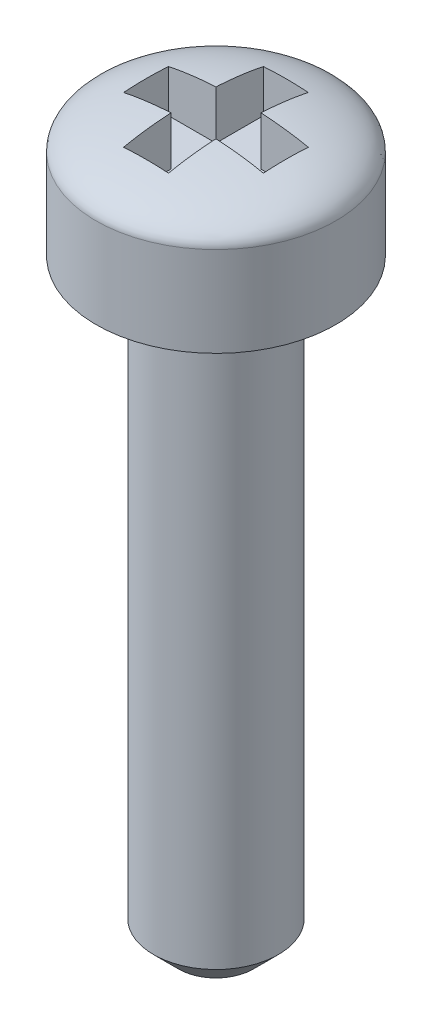
ISO-10303-21;
HEADER;
FILE_DESCRIPTION(('STEP AP214'),'2;1');
FILE_NAME('part.step','',(''),(''),'','','');
FILE_SCHEMA(('AUTOMOTIVE_DESIGN { 1 0 10303 214 1 1 1 1 }'));
ENDSEC;
DATA;
#1=APPLICATION_CONTEXT('core data for automotive mechanical design processes');
#2=APPLICATION_PROTOCOL_DEFINITION('international standard','automotive_design',2000,#1);
#3=PRODUCT_CONTEXT('',#1,'mechanical');
#4=PRODUCT('Part','Part','',(#3));
#5=PRODUCT_RELATED_PRODUCT_CATEGORY('part','',(#4));
#6=PRODUCT_DEFINITION_FORMATION('','',#4);
#7=PRODUCT_DEFINITION_CONTEXT('part definition',#1,'design');
#8=PRODUCT_DEFINITION('design','',#6,#7);
#9=PRODUCT_DEFINITION_SHAPE('','',#8);
#10=(LENGTH_UNIT() NAMED_UNIT(*) SI_UNIT(.MILLI.,.METRE.));
#11=(NAMED_UNIT(*) PLANE_ANGLE_UNIT() SI_UNIT($,.RADIAN.));
#12=(NAMED_UNIT(*) SI_UNIT($,.STERADIAN.) SOLID_ANGLE_UNIT());
#13=UNCERTAINTY_MEASURE_WITH_UNIT(LENGTH_MEASURE(1.E-05),#10,'distance_accuracy_value','');
#14=(GEOMETRIC_REPRESENTATION_CONTEXT(3) GLOBAL_UNCERTAINTY_ASSIGNED_CONTEXT((#13)) GLOBAL_UNIT_ASSIGNED_CONTEXT((#10,
#11,#12)) REPRESENTATION_CONTEXT('',''));
#15=CARTESIAN_POINT('',(0.,0.,0.));
#16=DIRECTION('',(0.,0.,1.));
#17=DIRECTION('',(1.,0.,0.));
#18=AXIS2_PLACEMENT_3D('',#15,#16,#17);
#19=CARTESIAN_POINT('',(0.,-14.5,0.));
#20=DIRECTION('',(0.,-1.,0.));
#21=DIRECTION('',(1.,0.,0.));
#22=AXIS2_PLACEMENT_3D('',#19,#20,#21);
#23=PLANE('',#22);
#24=CARTESIAN_POINT('',(0.,-14.5,0.));
#25=DIRECTION('',(0.,1.,0.));
#26=DIRECTION('',(-1.,0.,0.));
#27=AXIS2_PLACEMENT_3D('',#24,#25,#26);
#28=CIRCLE('',#27,0.750000000000002);
#29=CARTESIAN_POINT('',(-0.750000000000003,-14.5,0.));
#30=VERTEX_POINT('',#29);
#31=EDGE_CURVE('E172',#30,#30,#28,.T.);
#32=ORIENTED_EDGE('',*,*,#31,.F.);
#33=EDGE_LOOP('',(#32));
#34=FACE_BOUND('',#33,.T.);
#35=ADVANCED_FACE('F32',(#34),#23,.T.);
#36=CARTESIAN_POINT('',(0.,-0.7,0.));
#37=DIRECTION('',(0.,0.,1.));
#38=DIRECTION('',(-1.,0.,0.));
#39=AXIS2_PLACEMENT_3D('',#36,#37,#38);
#40=ELLIPSE('',#39,2.4,0.7);
#41=TRIMMED_CURVE('',#40,(PARAMETER_VALUE(4.71238898038469)),
(PARAMETER_VALUE(7.85398163397448)),.T.,.PARAMETER.);
#42=CARTESIAN_POINT('',(0.,0.,0.));
#43=DIRECTION('',(0.,1.,0.));
#44=AXIS1_PLACEMENT('',#42,#43);
#45=SURFACE_OF_REVOLUTION('',#41,#44);
#46=CARTESIAN_POINT('',(-0.45,-0.146793595130272,-1.4));
#47=CARTESIAN_POINT('',(-0.45,-0.135582510868077,-1.3478630783531));
#48=CARTESIAN_POINT('',(-0.45,-0.125272540703667,-1.29553939648451));
#49=CARTESIAN_POINT('',(-0.45,-0.106284613237851,-1.19067152435324));
#50=CARTESIAN_POINT('',(-0.45,-0.0976043872413721,-1.13812774629218));
#51=CARTESIAN_POINT('',(-0.45,-0.0816797603127905,-1.03285537623687));
#52=CARTESIAN_POINT('',(-0.45,-0.0744345609484523,-0.980126903719571));
#53=CARTESIAN_POINT('',(-0.45,-0.061255094243421,-0.874515075797136));
#54=CARTESIAN_POINT('',(-0.45,-0.0553206291320952,-0.821631744979628));
#55=CARTESIAN_POINT('',(-0.45,-0.0446639929310028,-0.715706069557348));
#56=CARTESIAN_POINT('',(-0.45,-0.0399426840621264,-0.662663638814433));
#57=CARTESIAN_POINT('',(-0.45,-0.0316501207388798,-0.556424085564358));
#58=CARTESIAN_POINT('',(-0.45,-0.0280802660002401,-0.503226853511595));
#59=CARTESIAN_POINT('',(-0.45,-0.0250578728513088,-0.449999999999999));
#60=B_SPLINE_CURVE_WITH_KNOTS('',3,(#46,#47,#48,#49,#50,#51,#52,#53,#54,#55,#56,#57,#58,#59),
.UNSPECIFIED.,.F.,.F.,(4,2,2,2,2,2,4),(0.,0.15996808704616,0.319711811185746,0.479366404537297,
0.63899689186355,0.798740520758241,0.958677609631265),.UNSPECIFIED.);
#61=CARTESIAN_POINT('',(-0.45,-0.146793595130272,-1.4));
#62=VERTEX_POINT('',#61);
#63=CARTESIAN_POINT('',(-0.45,-0.0250578728513089,-0.45));
#64=VERTEX_POINT('',#63);
#65=EDGE_CURVE('E11',#62,#64,#60,.T.);
#66=ORIENTED_EDGE('',*,*,#65,.F.);
#67=CARTESIAN_POINT('',(0.45,-0.146793595130272,-1.4));
#68=CARTESIAN_POINT('',(0.400036381373439,-0.143339935814697,-1.4));
#69=CARTESIAN_POINT('',(0.350032330421605,-0.140484168269285,-1.4));
#70=CARTESIAN_POINT('',(0.250023244110168,-0.135939007443069,-1.4));
#71=CARTESIAN_POINT('',(0.200018263881785,-0.134248403967048,-1.4));
#72=CARTESIAN_POINT('',(0.100008847147215,-0.131997688845388,-1.4));
#73=CARTESIAN_POINT('',(0.0500044235736076,-0.131436996552805,-1.4));
#74=CARTESIAN_POINT('',(-0.0500044235736076,-0.131436996552805,-1.4));
#75=CARTESIAN_POINT('',(-0.100008847147215,-0.131997688845388,-1.4));
#76=CARTESIAN_POINT('',(-0.200018263881785,-0.134248403967048,-1.4));
#77=CARTESIAN_POINT('',(-0.250023244110168,-0.135939007443069,-1.4));
#78=CARTESIAN_POINT('',(-0.350032330421605,-0.140484168269285,-1.4));
#79=CARTESIAN_POINT('',(-0.400036381373439,-0.143339935814697,-1.4));
#80=CARTESIAN_POINT('',(-0.45,-0.146793595130272,-1.4));
#81=B_SPLINE_CURVE_WITH_KNOTS('',3,(#67,#68,#69,#70,#71,#72,#73,#74,#75,#76,#77,#78,#79,#80),
.UNSPECIFIED.,.F.,.F.,(4,2,2,2,2,2,4),(0.,0.150243606811157,0.300330927284267,0.450341100109752,
0.600351272935238,0.750438593408348,0.900682200219505),.UNSPECIFIED.);
#82=CARTESIAN_POINT('',(0.45,-0.146793595130272,-1.4));
#83=VERTEX_POINT('',#82);
#84=EDGE_CURVE('E43',#83,#62,#81,.T.);
#85=ORIENTED_EDGE('',*,*,#84,.F.);
#86=CARTESIAN_POINT('',(0.45,-0.0250578728513089,-0.45));
#87=CARTESIAN_POINT('',(0.45,-0.0280802660002401,-0.503226853511596));
#88=CARTESIAN_POINT('',(0.45,-0.0316501207388798,-0.556424085564358));
#89=CARTESIAN_POINT('',(0.45,-0.0399426840621265,-0.662663638814433));
#90=CARTESIAN_POINT('',(0.45,-0.0446639929310029,-0.715706069557348));
#91=CARTESIAN_POINT('',(0.45,-0.0553206291320953,-0.821631744979629));
#92=CARTESIAN_POINT('',(0.45,-0.061255094243421,-0.874515075797136));
#93=CARTESIAN_POINT('',(0.45,-0.0744345609484524,-0.980126903719572));
#94=CARTESIAN_POINT('',(0.45,-0.0816797603127905,-1.03285537623687));
#95=CARTESIAN_POINT('',(0.45,-0.0976043872413722,-1.13812774629218));
#96=CARTESIAN_POINT('',(0.45,-0.106284613237851,-1.19067152435324));
#97=CARTESIAN_POINT('',(0.45,-0.125272540703667,-1.29553939648451));
#98=CARTESIAN_POINT('',(0.45,-0.135582510868077,-1.3478630783531));
#99=CARTESIAN_POINT('',(0.449999999999999,-0.146793595130273,-1.4));
#100=B_SPLINE_CURVE_WITH_KNOTS('',3,(#86,#87,#88,#89,#90,#91,#92,#93,#94,#95,#96,#97,#98,#99),
.UNSPECIFIED.,.F.,.F.,(4,2,2,2,2,2,4),(0.,0.159937088873024,0.319680717767715,0.479311205093968,
0.638965798445519,0.798709522585105,0.958677609631265),.UNSPECIFIED.);
#101=CARTESIAN_POINT('',(0.45,-0.0250578728513089,-0.45));
#102=VERTEX_POINT('',#101);
#103=EDGE_CURVE('E277',#102,#83,#100,.T.);
#104=ORIENTED_EDGE('',*,*,#103,.F.);
#105=CARTESIAN_POINT('',(1.4,-0.146793595130273,-0.45));
#106=CARTESIAN_POINT('',(1.3478630783531,-0.135582510868078,-0.45));
#107=CARTESIAN_POINT('',(1.29553939648451,-0.125272540703667,-0.45));
#108=CARTESIAN_POINT('',(1.19067152435324,-0.106284613237851,-0.45));
#109=CARTESIAN_POINT('',(1.13812774629218,-0.0976043872413722,-0.45));
#110=CARTESIAN_POINT('',(1.03285537623687,-0.0816797603127905,-0.45));
#111=CARTESIAN_POINT('',(0.980126903719572,-0.0744345609484524,-0.45));
#112=CARTESIAN_POINT('',(0.874515075797136,-0.061255094243421,-0.45));
#113=CARTESIAN_POINT('',(0.821631744979628,-0.0553206291320953,-0.45));
#114=CARTESIAN_POINT('',(0.715706069557348,-0.0446639929310028,-0.45));
#115=CARTESIAN_POINT('',(0.662663638814433,-0.0399426840621265,-0.45));
#116=CARTESIAN_POINT('',(0.556424085564358,-0.0316501207388798,-0.45));
#117=CARTESIAN_POINT('',(0.503226853511596,-0.0280802660002401,-0.45));
#118=CARTESIAN_POINT('',(0.449999999999999,-0.0250578728513089,-0.45));
#119=B_SPLINE_CURVE_WITH_KNOTS('',3,(#105,#106,#107,#108,#109,#110,#111,#112,#113,#114,#115,
#116,#117,#118),.UNSPECIFIED.,.F.,.F.,(4,2,2,2,2,2,4),(0.,0.15996808704616,0.319711811185746,
0.479366404537297,0.63899689186355,0.798740520758241,0.958677609631265),.UNSPECIFIED.);
#120=CARTESIAN_POINT('',(1.4,-0.146793595130273,-0.45));
#121=VERTEX_POINT('',#120);
#122=EDGE_CURVE('E271',#121,#102,#119,.T.);
#123=ORIENTED_EDGE('',*,*,#122,.F.);
#124=CARTESIAN_POINT('',(1.4,-0.146793595130273,0.45));
#125=CARTESIAN_POINT('',(1.4,-0.143339935814697,0.400036381373439));
#126=CARTESIAN_POINT('',(1.4,-0.140484168269285,0.350032330421605));
#127=CARTESIAN_POINT('',(1.4,-0.135939007443069,0.250023244110168));
#128=CARTESIAN_POINT('',(1.4,-0.134248403967048,0.200018263881785));
#129=CARTESIAN_POINT('',(1.4,-0.131997688845388,0.100008847147215));
#130=CARTESIAN_POINT('',(1.4,-0.131436996552805,0.0500044235736077));
#131=CARTESIAN_POINT('',(1.4,-0.131436996552805,-0.0500044235736073));
#132=CARTESIAN_POINT('',(1.4,-0.131997688845388,-0.100008847147215));
#133=CARTESIAN_POINT('',(1.4,-0.134248403967048,-0.200018263881785));
#134=CARTESIAN_POINT('',(1.4,-0.135939007443069,-0.250023244110168));
#135=CARTESIAN_POINT('',(1.4,-0.140484168269285,-0.350032330421605));
#136=CARTESIAN_POINT('',(1.4,-0.143339935814697,-0.400036381373439));
#137=CARTESIAN_POINT('',(1.4,-0.146793595130273,-0.449999999999999));
#138=B_SPLINE_CURVE_WITH_KNOTS('',3,(#124,#125,#126,#127,#128,#129,#130,#131,#132,#133,#134,
#135,#136,#137),.UNSPECIFIED.,.F.,.F.,(4,2,2,2,2,2,4),(0.,0.150243606811157,0.300330927284267,
0.450341100109752,0.600351272935237,0.750438593408347,0.900682200219504),.UNSPECIFIED.);
#139=CARTESIAN_POINT('',(1.4,-0.146793595130273,0.45));
#140=VERTEX_POINT('',#139);
#141=EDGE_CURVE('E264',#140,#121,#138,.T.);
#142=ORIENTED_EDGE('',*,*,#141,.F.);
#143=CARTESIAN_POINT('',(0.45,-0.0250578728513089,0.45));
#144=CARTESIAN_POINT('',(0.503226853511596,-0.0280802660002401,0.45));
#145=CARTESIAN_POINT('',(0.556424085564358,-0.0316501207388799,0.45));
#146=CARTESIAN_POINT('',(0.662663638814433,-0.0399426840621265,0.45));
#147=CARTESIAN_POINT('',(0.715706069557348,-0.0446639929310029,0.45));
#148=CARTESIAN_POINT('',(0.821631744979629,-0.0553206291320953,0.45));
#149=CARTESIAN_POINT('',(0.874515075797136,-0.0612550942434211,0.45));
#150=CARTESIAN_POINT('',(0.980126903719572,-0.0744345609484524,0.45));
#151=CARTESIAN_POINT('',(1.03285537623687,-0.0816797603127906,0.45));
#152=CARTESIAN_POINT('',(1.13812774629218,-0.0976043872413723,0.45));
#153=CARTESIAN_POINT('',(1.19067152435324,-0.106284613237851,0.45));
#154=CARTESIAN_POINT('',(1.29553939648451,-0.125272540703667,0.45));
#155=CARTESIAN_POINT('',(1.3478630783531,-0.135582510868078,0.45));
#156=CARTESIAN_POINT('',(1.4,-0.146793595130273,0.45));
#157=B_SPLINE_CURVE_WITH_KNOTS('',3,(#143,#144,#145,#146,#147,#148,#149,#150,#151,#152,#153,
#154,#155,#156),.UNSPECIFIED.,.F.,.F.,(4,2,2,2,2,2,4),(0.,0.159937088873024,0.319680717767716,
0.479311205093968,0.638965798445519,0.798709522585105,0.958677609631265),.UNSPECIFIED.);
#158=CARTESIAN_POINT('',(0.45,-0.0250578728513089,0.45));
#159=VERTEX_POINT('',#158);
#160=EDGE_CURVE('E257',#159,#140,#157,.T.);
#161=ORIENTED_EDGE('',*,*,#160,.F.);
#162=CARTESIAN_POINT('',(0.45,-0.146793595130272,1.4));
#163=CARTESIAN_POINT('',(0.45,-0.135582510868077,1.3478630783531));
#164=CARTESIAN_POINT('',(0.45,-0.125272540703667,1.29553939648451));
#165=CARTESIAN_POINT('',(0.45,-0.106284613237851,1.19067152435324));
#166=CARTESIAN_POINT('',(0.45,-0.0976043872413722,1.13812774629218));
#167=CARTESIAN_POINT('',(0.45,-0.0816797603127905,1.03285537623687));
#168=CARTESIAN_POINT('',(0.45,-0.0744345609484524,0.980126903719571));
#169=CARTESIAN_POINT('',(0.45,-0.061255094243421,0.874515075797136));
#170=CARTESIAN_POINT('',(0.45,-0.0553206291320953,0.821631744979628));
#171=CARTESIAN_POINT('',(0.45,-0.0446639929310028,0.715706069557348));
#172=CARTESIAN_POINT('',(0.45,-0.0399426840621265,0.662663638814433));
#173=CARTESIAN_POINT('',(0.45,-0.0316501207388798,0.556424085564358));
#174=CARTESIAN_POINT('',(0.45,-0.0280802660002401,0.503226853511595));
#175=CARTESIAN_POINT('',(0.45,-0.0250578728513089,0.449999999999999));
#176=B_SPLINE_CURVE_WITH_KNOTS('',3,(#162,#163,#164,#165,#166,#167,#168,#169,#170,#171,#172,
#173,#174,#175),.UNSPECIFIED.,.F.,.F.,(4,2,2,2,2,2,4),(0.,0.15996808704616,0.319711811185746,
0.479366404537297,0.63899689186355,0.798740520758241,0.958677609631265),.UNSPECIFIED.);
#177=CARTESIAN_POINT('',(0.45,-0.146793595130272,1.4));
#178=VERTEX_POINT('',#177);
#179=EDGE_CURVE('E250',#178,#159,#176,.T.);
#180=ORIENTED_EDGE('',*,*,#179,.F.);
#181=CARTESIAN_POINT('',(-0.45,-0.146793595130272,1.4));
#182=CARTESIAN_POINT('',(-0.400036381373439,-0.143339935814697,1.4));
#183=CARTESIAN_POINT('',(-0.350032330421605,-0.140484168269285,1.4));
#184=CARTESIAN_POINT('',(-0.250023244110168,-0.135939007443069,1.4));
#185=CARTESIAN_POINT('',(-0.200018263881785,-0.134248403967048,1.4));
#186=CARTESIAN_POINT('',(-0.100008847147215,-0.131997688845388,1.4));
#187=CARTESIAN_POINT('',(-0.0500044235736078,-0.131436996552805,1.4));
#188=CARTESIAN_POINT('',(0.0500044235736073,-0.131436996552805,1.4));
#189=CARTESIAN_POINT('',(0.100008847147215,-0.131997688845388,1.4));
#190=CARTESIAN_POINT('',(0.200018263881785,-0.134248403967048,1.4));
#191=CARTESIAN_POINT('',(0.250023244110168,-0.135939007443069,1.4));
#192=CARTESIAN_POINT('',(0.350032330421605,-0.140484168269285,1.4));
#193=CARTESIAN_POINT('',(0.400036381373439,-0.143339935814697,1.4));
#194=CARTESIAN_POINT('',(0.449999999999999,-0.146793595130273,1.4));
#195=B_SPLINE_CURVE_WITH_KNOTS('',3,(#181,#182,#183,#184,#185,#186,#187,#188,#189,#190,#191,
#192,#193,#194),.UNSPECIFIED.,.F.,.F.,(4,2,2,2,2,2,4),(0.,0.150243606811157,0.300330927284267,
0.450341100109752,0.600351272935237,0.750438593408347,0.900682200219504),.UNSPECIFIED.);
#196=CARTESIAN_POINT('',(-0.45,-0.146793595130273,1.4));
#197=VERTEX_POINT('',#196);
#198=EDGE_CURVE('E243',#197,#178,#195,.T.);
#199=ORIENTED_EDGE('',*,*,#198,.F.);
#200=CARTESIAN_POINT('',(-0.45,-0.0250578728513089,0.45));
#201=CARTESIAN_POINT('',(-0.45,-0.0280802660002401,0.503226853511596));
#202=CARTESIAN_POINT('',(-0.45,-0.0316501207388798,0.556424085564358));
#203=CARTESIAN_POINT('',(-0.45,-0.0399426840621264,0.662663638814433));
#204=CARTESIAN_POINT('',(-0.45,-0.0446639929310028,0.715706069557348));
#205=CARTESIAN_POINT('',(-0.45,-0.0553206291320952,0.821631744979628));
#206=CARTESIAN_POINT('',(-0.45,-0.061255094243421,0.874515075797136));
#207=CARTESIAN_POINT('',(-0.45,-0.0744345609484523,0.980126903719571));
#208=CARTESIAN_POINT('',(-0.45,-0.0816797603127905,1.03285537623687));
#209=CARTESIAN_POINT('',(-0.45,-0.0976043872413721,1.13812774629218));
#210=CARTESIAN_POINT('',(-0.45,-0.10628461323785,1.19067152435324));
#211=CARTESIAN_POINT('',(-0.45,-0.125272540703667,1.29553939648451));
#212=CARTESIAN_POINT('',(-0.45,-0.135582510868077,1.3478630783531));
#213=CARTESIAN_POINT('',(-0.45,-0.146793595130272,1.4));
#214=B_SPLINE_CURVE_WITH_KNOTS('',3,(#200,#201,#202,#203,#204,#205,#206,#207,#208,#209,#210,
#211,#212,#213),.UNSPECIFIED.,.F.,.F.,(4,2,2,2,2,2,4),(0.,0.159937088873024,0.319680717767715,
0.479311205093968,0.638965798445519,0.798709522585104,0.958677609631264),.UNSPECIFIED.);
#215=CARTESIAN_POINT('',(-0.45,-0.0250578728513089,0.45));
#216=VERTEX_POINT('',#215);
#217=EDGE_CURVE('E236',#216,#197,#214,.T.);
#218=ORIENTED_EDGE('',*,*,#217,.F.);
#219=CARTESIAN_POINT('',(-1.4,-0.146793595130272,0.45));
#220=CARTESIAN_POINT('',(-1.3478630783531,-0.135582510868077,0.45));
#221=CARTESIAN_POINT('',(-1.29553939648451,-0.125272540703667,0.45));
#222=CARTESIAN_POINT('',(-1.19067152435324,-0.10628461323785,0.45));
#223=CARTESIAN_POINT('',(-1.13812774629218,-0.0976043872413721,0.45));
#224=CARTESIAN_POINT('',(-1.03285537623687,-0.0816797603127904,0.45));
#225=CARTESIAN_POINT('',(-0.980126903719571,-0.0744345609484523,0.45));
#226=CARTESIAN_POINT('',(-0.874515075797136,-0.0612550942434209,0.45));
#227=CARTESIAN_POINT('',(-0.821631744979628,-0.0553206291320952,0.45));
#228=CARTESIAN_POINT('',(-0.715706069557348,-0.0446639929310027,0.45));
#229=CARTESIAN_POINT('',(-0.662663638814433,-0.0399426840621264,0.45));
#230=CARTESIAN_POINT('',(-0.556424085564358,-0.0316501207388797,0.45));
#231=CARTESIAN_POINT('',(-0.503226853511595,-0.02808026600024,0.45));
#232=CARTESIAN_POINT('',(-0.45,-0.0250578728513088,0.45));
#233=B_SPLINE_CURVE_WITH_KNOTS('',3,(#219,#220,#221,#222,#223,#224,#225,#226,#227,#228,#229,
#230,#231,#232),.UNSPECIFIED.,.F.,.F.,(4,2,2,2,2,2,4),(0.,0.15996808704616,0.319711811185746,
0.479366404537297,0.63899689186355,0.798740520758241,0.958677609631265),.UNSPECIFIED.);
#234=CARTESIAN_POINT('',(-1.4,-0.146793595130272,0.45));
#235=VERTEX_POINT('',#234);
#236=EDGE_CURVE('E229',#235,#216,#233,.T.);
#237=ORIENTED_EDGE('',*,*,#236,.F.);
#238=CARTESIAN_POINT('',(-1.4,-0.146793595130272,-0.45));
#239=CARTESIAN_POINT('',(-1.4,-0.143339935814697,-0.400036381373439));
#240=CARTESIAN_POINT('',(-1.4,-0.140484168269285,-0.350032330421606));
#241=CARTESIAN_POINT('',(-1.4,-0.135939007443069,-0.250023244110169));
#242=CARTESIAN_POINT('',(-1.4,-0.134248403967048,-0.200018263881786));
#243=CARTESIAN_POINT('',(-1.4,-0.131997688845388,-0.100008847147215));
#244=CARTESIAN_POINT('',(-1.4,-0.131436996552805,-0.0500044235736077));
#245=CARTESIAN_POINT('',(-1.4,-0.131436996552805,0.0500044235736075));
#246=CARTESIAN_POINT('',(-1.4,-0.131997688845388,0.100008847147215));
#247=CARTESIAN_POINT('',(-1.4,-0.134248403967048,0.200018263881785));
#248=CARTESIAN_POINT('',(-1.4,-0.135939007443069,0.250023244110168));
#249=CARTESIAN_POINT('',(-1.4,-0.140484168269285,0.350032330421605));
#250=CARTESIAN_POINT('',(-1.4,-0.143339935814697,0.400036381373439));
#251=CARTESIAN_POINT('',(-1.4,-0.146793595130272,0.45));
#252=B_SPLINE_CURVE_WITH_KNOTS('',3,(#238,#239,#240,#241,#242,#243,#244,#245,#246,#247,#248,
#249,#250,#251),.UNSPECIFIED.,.F.,.F.,(4,2,2,2,2,2,4),(0.,0.150243606811157,0.300330927284267,
0.450341100109753,0.600351272935238,0.750438593408348,0.900682200219506),.UNSPECIFIED.);
#253=CARTESIAN_POINT('',(-1.4,-0.146793595130272,-0.45));
#254=VERTEX_POINT('',#253);
#255=EDGE_CURVE('E222',#254,#235,#252,.T.);
#256=ORIENTED_EDGE('',*,*,#255,.F.);
#257=CARTESIAN_POINT('',(-0.45,-0.0250578728513089,-0.45));
#258=CARTESIAN_POINT('',(-0.503226853511596,-0.0280802660002401,-0.45));
#259=CARTESIAN_POINT('',(-0.556424085564358,-0.0316501207388798,-0.45));
#260=CARTESIAN_POINT('',(-0.662663638814433,-0.0399426840621264,-0.45));
#261=CARTESIAN_POINT('',(-0.715706069557348,-0.0446639929310028,-0.45));
#262=CARTESIAN_POINT('',(-0.821631744979628,-0.0553206291320952,-0.45));
#263=CARTESIAN_POINT('',(-0.874515075797136,-0.0612550942434209,-0.45));
#264=CARTESIAN_POINT('',(-0.980126903719571,-0.0744345609484523,-0.45));
#265=CARTESIAN_POINT('',(-1.03285537623687,-0.0816797603127905,-0.45));
#266=CARTESIAN_POINT('',(-1.13812774629218,-0.0976043872413721,-0.45));
#267=CARTESIAN_POINT('',(-1.19067152435324,-0.10628461323785,-0.45));
#268=CARTESIAN_POINT('',(-1.29553939648451,-0.125272540703667,-0.45));
#269=CARTESIAN_POINT('',(-1.3478630783531,-0.135582510868077,-0.45));
#270=CARTESIAN_POINT('',(-1.4,-0.146793595130272,-0.45));
#271=B_SPLINE_CURVE_WITH_KNOTS('',3,(#257,#258,#259,#260,#261,#262,#263,#264,#265,#266,#267,
#268,#269,#270),.UNSPECIFIED.,.F.,.F.,(4,2,2,2,2,2,4),(0.,0.159937088873024,0.319680717767715,
0.479311205093968,0.638965798445519,0.798709522585104,0.958677609631264),.UNSPECIFIED.);
#272=EDGE_CURVE('E213',#64,#254,#271,.T.);
#273=ORIENTED_EDGE('',*,*,#272,.F.);
#274=EDGE_LOOP('',(#66,#85,#104,#123,#142,#161,#180,#199,#218,#237,#256,#273));
#275=FACE_BOUND('',#274,.T.);
#276=CARTESIAN_POINT('',(0.,-0.7,0.));
#277=DIRECTION('',(0.,1.,0.));
#278=DIRECTION('',(-1.,0.,0.));
#279=AXIS2_PLACEMENT_3D('',#276,#277,#278);
#280=CIRCLE('',#279,2.4);
#281=CARTESIAN_POINT('',(-2.4,-0.7,0.));
#282=VERTEX_POINT('',#281);
#283=EDGE_CURVE('E361',#282,#282,#280,.T.);
#284=ORIENTED_EDGE('',*,*,#283,.T.);
#285=EDGE_LOOP('',(#284));
#286=FACE_BOUND('',#285,.T.);
#287=ADVANCED_FACE('F203',(#275,#286),#45,.F.);
#288=CARTESIAN_POINT('',(0.,0.,0.));
#289=DIRECTION('',(0.,1.,0.));
#290=DIRECTION('',(-1.,0.,0.));
#291=AXIS2_PLACEMENT_3D('',#288,#289,#290);
#292=CYLINDRICAL_SURFACE('',#291,2.4);
#293=CARTESIAN_POINT('',(0.,-2.5,0.));
#294=DIRECTION('',(0.,1.,0.));
#295=DIRECTION('',(-1.,0.,0.));
#296=AXIS2_PLACEMENT_3D('',#293,#294,#295);
#297=CIRCLE('',#296,2.4);
#298=CARTESIAN_POINT('',(-2.4,-2.5,0.));
#299=VERTEX_POINT('',#298);
#300=EDGE_CURVE('E357',#299,#299,#297,.T.);
#301=ORIENTED_EDGE('',*,*,#300,.T.);
#302=EDGE_LOOP('',(#301));
#303=FACE_BOUND('',#302,.T.);
#304=ORIENTED_EDGE('',*,*,#283,.F.);
#305=EDGE_LOOP('',(#304));
#306=FACE_BOUND('',#305,.T.);
#307=ADVANCED_FACE('F207',(#303,#306),#292,.T.);
#308=CARTESIAN_POINT('',(-1.25,-2.5,0.));
#309=DIRECTION('',(0.,-1.,0.));
#310=DIRECTION('',(1.,0.,0.));
#311=AXIS2_PLACEMENT_3D('',#308,#309,#310);
#312=PLANE('',#311);
#313=CARTESIAN_POINT('',(0.,-2.5,0.));
#314=DIRECTION('',(0.,1.,0.));
#315=DIRECTION('',(-1.,0.,0.));
#316=AXIS2_PLACEMENT_3D('',#313,#314,#315);
#317=CIRCLE('',#316,1.25);
#318=CARTESIAN_POINT('',(-1.25,-2.5,0.));
#319=VERTEX_POINT('',#318);
#320=EDGE_CURVE('E355',#319,#319,#317,.T.);
#321=ORIENTED_EDGE('',*,*,#320,.T.);
#322=EDGE_LOOP('',(#321));
#323=FACE_BOUND('',#322,.T.);
#324=ORIENTED_EDGE('',*,*,#300,.F.);
#325=EDGE_LOOP('',(#324));
#326=FACE_BOUND('',#325,.T.);
#327=ADVANCED_FACE('F337',(#323,#326),#312,.T.);
#328=CARTESIAN_POINT('',(0.,0.,0.));
#329=DIRECTION('',(0.,1.,0.));
#330=DIRECTION('',(-1.,0.,0.));
#331=AXIS2_PLACEMENT_3D('',#328,#329,#330);
#332=CYLINDRICAL_SURFACE('',#331,1.25);
#333=CARTESIAN_POINT('',(0.,-14.,0.));
#334=DIRECTION('',(0.,1.,0.));
#335=DIRECTION('',(-1.,0.,0.));
#336=AXIS2_PLACEMENT_3D('',#333,#334,#335);
#337=CIRCLE('',#336,1.25);
#338=CARTESIAN_POINT('',(-1.25,-14.,0.));
#339=VERTEX_POINT('',#338);
#340=EDGE_CURVE('E353',#339,#339,#337,.T.);
#341=ORIENTED_EDGE('',*,*,#340,.T.);
#342=EDGE_LOOP('',(#341));
#343=FACE_BOUND('',#342,.T.);
#344=ORIENTED_EDGE('',*,*,#320,.F.);
#345=EDGE_LOOP('',(#344));
#346=FACE_BOUND('',#345,.T.);
#347=ADVANCED_FACE('F334',(#343,#346),#332,.T.);
#348=CARTESIAN_POINT('',(0.,-14.,0.));
#349=DIRECTION('',(0.,1.,0.));
#350=DIRECTION('',(-1.,0.,0.));
#351=AXIS2_PLACEMENT_3D('',#348,#349,#350);
#352=CONICAL_SURFACE('',#351,1.25,0.785398163397447);
#353=ORIENTED_EDGE('',*,*,#31,.T.);
#354=EDGE_LOOP('',(#353));
#355=FACE_BOUND('',#354,.T.);
#356=ORIENTED_EDGE('',*,*,#340,.F.);
#357=EDGE_LOOP('',(#356));
#358=FACE_BOUND('',#357,.T.);
#359=ADVANCED_FACE('F331',(#355,#358),#352,.T.);
#360=CARTESIAN_POINT('',(-0.45,-1.,-1.4));
#361=DIRECTION('',(-1.,0.,0.));
#362=DIRECTION('',(0.,0.,1.));
#363=AXIS2_PLACEMENT_3D('',#360,#361,#362);
#364=PLANE('',#363);
#365=ORIENTED_EDGE('',*,*,#65,.T.);
#366=DIRECTION('',(0.,1.,0.));
#367=VECTOR('',#366,1.);
#368=CARTESIAN_POINT('',(-0.45,-1.,-0.45));
#369=LINE('',#368,#367);
#370=CARTESIAN_POINT('',(-0.45,-1.,-0.45));
#371=VERTEX_POINT('',#370);
#372=EDGE_CURVE('E50',#371,#64,#369,.T.);
#373=ORIENTED_EDGE('',*,*,#372,.F.);
#374=DIRECTION('',(0.,0.,1.));
#375=VECTOR('',#374,1.);
#376=CARTESIAN_POINT('',(-0.45,-1.,-1.4));
#377=LINE('',#376,#375);
#378=CARTESIAN_POINT('',(-0.45,-1.,-1.4));
#379=VERTEX_POINT('',#378);
#380=EDGE_CURVE('E124',#379,#371,#377,.T.);
#381=ORIENTED_EDGE('',*,*,#380,.F.);
#382=DIRECTION('',(0.,1.,0.));
#383=VECTOR('',#382,1.);
#384=CARTESIAN_POINT('',(-0.45,-1.,-1.4));
#385=LINE('',#384,#383);
#386=EDGE_CURVE('E170',#379,#62,#385,.T.);
#387=ORIENTED_EDGE('',*,*,#386,.T.);
#388=EDGE_LOOP('',(#365,#373,#381,#387));
#389=FACE_BOUND('',#388,.T.);
#390=ADVANCED_FACE('F122',(#389),#364,.F.);
#391=CARTESIAN_POINT('',(-0.45,-1.,-1.4));
#392=DIRECTION('',(0.,0.,-1.));
#393=DIRECTION('',(-1.,0.,0.));
#394=AXIS2_PLACEMENT_3D('',#391,#392,#393);
#395=PLANE('',#394);
#396=ORIENTED_EDGE('',*,*,#84,.T.);
#397=ORIENTED_EDGE('',*,*,#386,.F.);
#398=DIRECTION('',(-1.,0.,0.));
#399=VECTOR('',#398,1.);
#400=CARTESIAN_POINT('',(-0.45,-1.,-1.4));
#401=LINE('',#400,#399);
#402=CARTESIAN_POINT('',(0.45,-1.,-1.4));
#403=VERTEX_POINT('',#402);
#404=EDGE_CURVE('E129',#403,#379,#401,.T.);
#405=ORIENTED_EDGE('',*,*,#404,.F.);
#406=DIRECTION('',(0.,1.,0.));
#407=VECTOR('',#406,1.);
#408=CARTESIAN_POINT('',(0.45,-1.,-1.4));
#409=LINE('',#408,#407);
#410=EDGE_CURVE('E173',#403,#83,#409,.T.);
#411=ORIENTED_EDGE('',*,*,#410,.T.);
#412=EDGE_LOOP('',(#396,#397,#405,#411));
#413=FACE_BOUND('',#412,.T.);
#414=ADVANCED_FACE('F286',(#413),#395,.F.);
#415=CARTESIAN_POINT('',(0.45,-1.,-1.4));
#416=DIRECTION('',(1.,0.,0.));
#417=DIRECTION('',(0.,0.,-1.));
#418=AXIS2_PLACEMENT_3D('',#415,#416,#417);
#419=PLANE('',#418);
#420=ORIENTED_EDGE('',*,*,#103,.T.);
#421=ORIENTED_EDGE('',*,*,#410,.F.);
#422=DIRECTION('',(0.,0.,-1.));
#423=VECTOR('',#422,1.);
#424=CARTESIAN_POINT('',(0.45,-1.,-1.4));
#425=LINE('',#424,#423);
#426=CARTESIAN_POINT('',(0.45,-1.,-0.45));
#427=VERTEX_POINT('',#426);
#428=EDGE_CURVE('E167',#427,#403,#425,.T.);
#429=ORIENTED_EDGE('',*,*,#428,.F.);
#430=DIRECTION('',(0.,1.,0.));
#431=VECTOR('',#430,1.);
#432=CARTESIAN_POINT('',(0.45,-1.,-0.45));
#433=LINE('',#432,#431);
#434=EDGE_CURVE('E175',#427,#102,#433,.T.);
#435=ORIENTED_EDGE('',*,*,#434,.T.);
#436=EDGE_LOOP('',(#420,#421,#429,#435));
#437=FACE_BOUND('',#436,.T.);
#438=ADVANCED_FACE('F290',(#437),#419,.F.);
#439=CARTESIAN_POINT('',(0.45,-1.,-0.45));
#440=DIRECTION('',(0.,0.,-1.));
#441=DIRECTION('',(-1.,0.,0.));
#442=AXIS2_PLACEMENT_3D('',#439,#440,#441);
#443=PLANE('',#442);
#444=ORIENTED_EDGE('',*,*,#122,.T.);
#445=ORIENTED_EDGE('',*,*,#434,.F.);
#446=DIRECTION('',(-1.,0.,0.));
#447=VECTOR('',#446,1.);
#448=CARTESIAN_POINT('',(0.45,-1.,-0.45));
#449=LINE('',#448,#447);
#450=CARTESIAN_POINT('',(1.4,-1.,-0.45));
#451=VERTEX_POINT('',#450);
#452=EDGE_CURVE('E164',#451,#427,#449,.T.);
#453=ORIENTED_EDGE('',*,*,#452,.F.);
#454=DIRECTION('',(0.,1.,0.));
#455=VECTOR('',#454,1.);
#456=CARTESIAN_POINT('',(1.4,-1.,-0.45));
#457=LINE('',#456,#455);
#458=EDGE_CURVE('E178',#451,#121,#457,.T.);
#459=ORIENTED_EDGE('',*,*,#458,.T.);
#460=EDGE_LOOP('',(#444,#445,#453,#459));
#461=FACE_BOUND('',#460,.T.);
#462=ADVANCED_FACE('F293',(#461),#443,.F.);
#463=CARTESIAN_POINT('',(1.4,-1.,0.45));
#464=DIRECTION('',(1.,0.,0.));
#465=DIRECTION('',(0.,0.,-1.));
#466=AXIS2_PLACEMENT_3D('',#463,#464,#465);
#467=PLANE('',#466);
#468=ORIENTED_EDGE('',*,*,#141,.T.);
#469=ORIENTED_EDGE('',*,*,#458,.F.);
#470=DIRECTION('',(0.,0.,-1.));
#471=VECTOR('',#470,1.);
#472=CARTESIAN_POINT('',(1.4,-1.,0.45));
#473=LINE('',#472,#471);
#474=CARTESIAN_POINT('',(1.4,-1.,0.45));
#475=VERTEX_POINT('',#474);
#476=EDGE_CURVE('E161',#475,#451,#473,.T.);
#477=ORIENTED_EDGE('',*,*,#476,.F.);
#478=DIRECTION('',(0.,1.,0.));
#479=VECTOR('',#478,1.);
#480=CARTESIAN_POINT('',(1.4,-1.,0.45));
#481=LINE('',#480,#479);
#482=EDGE_CURVE('E181',#475,#140,#481,.T.);
#483=ORIENTED_EDGE('',*,*,#482,.T.);
#484=EDGE_LOOP('',(#468,#469,#477,#483));
#485=FACE_BOUND('',#484,.T.);
#486=ADVANCED_FACE('F297',(#485),#467,.F.);
#487=CARTESIAN_POINT('',(0.45,-1.,0.45));
#488=DIRECTION('',(0.,0.,1.));
#489=DIRECTION('',(1.,0.,0.));
#490=AXIS2_PLACEMENT_3D('',#487,#488,#489);
#491=PLANE('',#490);
#492=ORIENTED_EDGE('',*,*,#160,.T.);
#493=ORIENTED_EDGE('',*,*,#482,.F.);
#494=DIRECTION('',(1.,0.,0.));
#495=VECTOR('',#494,1.);
#496=CARTESIAN_POINT('',(0.45,-1.,0.45));
#497=LINE('',#496,#495);
#498=CARTESIAN_POINT('',(0.45,-1.,0.45));
#499=VERTEX_POINT('',#498);
#500=EDGE_CURVE('E158',#499,#475,#497,.T.);
#501=ORIENTED_EDGE('',*,*,#500,.F.);
#502=DIRECTION('',(0.,1.,0.));
#503=VECTOR('',#502,1.);
#504=CARTESIAN_POINT('',(0.45,-1.,0.45));
#505=LINE('',#504,#503);
#506=EDGE_CURVE('E184',#499,#159,#505,.T.);
#507=ORIENTED_EDGE('',*,*,#506,.T.);
#508=EDGE_LOOP('',(#492,#493,#501,#507));
#509=FACE_BOUND('',#508,.T.);
#510=ADVANCED_FACE('F301',(#509),#491,.F.);
#511=CARTESIAN_POINT('',(0.45,-1.,0.45));
#512=DIRECTION('',(1.,0.,0.));
#513=DIRECTION('',(0.,0.,-1.));
#514=AXIS2_PLACEMENT_3D('',#511,#512,#513);
#515=PLANE('',#514);
#516=ORIENTED_EDGE('',*,*,#179,.T.);
#517=ORIENTED_EDGE('',*,*,#506,.F.);
#518=DIRECTION('',(0.,0.,-1.));
#519=VECTOR('',#518,1.);
#520=CARTESIAN_POINT('',(0.45,-1.,0.45));
#521=LINE('',#520,#519);
#522=CARTESIAN_POINT('',(0.45,-1.,1.4));
#523=VERTEX_POINT('',#522);
#524=EDGE_CURVE('E155',#523,#499,#521,.T.);
#525=ORIENTED_EDGE('',*,*,#524,.F.);
#526=DIRECTION('',(0.,1.,0.));
#527=VECTOR('',#526,1.);
#528=CARTESIAN_POINT('',(0.45,-1.,1.4));
#529=LINE('',#528,#527);
#530=EDGE_CURVE('E187',#523,#178,#529,.T.);
#531=ORIENTED_EDGE('',*,*,#530,.T.);
#532=EDGE_LOOP('',(#516,#517,#525,#531));
#533=FACE_BOUND('',#532,.T.);
#534=ADVANCED_FACE('F305',(#533),#515,.F.);
#535=CARTESIAN_POINT('',(-0.45,-1.,1.4));
#536=DIRECTION('',(0.,0.,1.));
#537=DIRECTION('',(1.,0.,0.));
#538=AXIS2_PLACEMENT_3D('',#535,#536,#537);
#539=PLANE('',#538);
#540=ORIENTED_EDGE('',*,*,#198,.T.);
#541=ORIENTED_EDGE('',*,*,#530,.F.);
#542=DIRECTION('',(1.,0.,0.));
#543=VECTOR('',#542,1.);
#544=CARTESIAN_POINT('',(-0.45,-1.,1.4));
#545=LINE('',#544,#543);
#546=CARTESIAN_POINT('',(-0.45,-1.,1.4));
#547=VERTEX_POINT('',#546);
#548=EDGE_CURVE('E152',#547,#523,#545,.T.);
#549=ORIENTED_EDGE('',*,*,#548,.F.);
#550=DIRECTION('',(0.,1.,0.));
#551=VECTOR('',#550,1.);
#552=CARTESIAN_POINT('',(-0.45,-1.,1.4));
#553=LINE('',#552,#551);
#554=EDGE_CURVE('E190',#547,#197,#553,.T.);
#555=ORIENTED_EDGE('',*,*,#554,.T.);
#556=EDGE_LOOP('',(#540,#541,#549,#555));
#557=FACE_BOUND('',#556,.T.);
#558=ADVANCED_FACE('F309',(#557),#539,.F.);
#559=CARTESIAN_POINT('',(-0.45,-1.,0.45));
#560=DIRECTION('',(-1.,0.,0.));
#561=DIRECTION('',(0.,0.,1.));
#562=AXIS2_PLACEMENT_3D('',#559,#560,#561);
#563=PLANE('',#562);
#564=ORIENTED_EDGE('',*,*,#217,.T.);
#565=ORIENTED_EDGE('',*,*,#554,.F.);
#566=DIRECTION('',(0.,0.,1.));
#567=VECTOR('',#566,1.);
#568=CARTESIAN_POINT('',(-0.45,-1.,0.45));
#569=LINE('',#568,#567);
#570=CARTESIAN_POINT('',(-0.45,-1.,0.45));
#571=VERTEX_POINT('',#570);
#572=EDGE_CURVE('E149',#571,#547,#569,.T.);
#573=ORIENTED_EDGE('',*,*,#572,.F.);
#574=DIRECTION('',(0.,1.,0.));
#575=VECTOR('',#574,1.);
#576=CARTESIAN_POINT('',(-0.45,-1.,0.45));
#577=LINE('',#576,#575);
#578=EDGE_CURVE('E193',#571,#216,#577,.T.);
#579=ORIENTED_EDGE('',*,*,#578,.T.);
#580=EDGE_LOOP('',(#564,#565,#573,#579));
#581=FACE_BOUND('',#580,.T.);
#582=ADVANCED_FACE('F313',(#581),#563,.F.);
#583=CARTESIAN_POINT('',(-1.4,-1.,0.45));
#584=DIRECTION('',(0.,0.,1.));
#585=DIRECTION('',(1.,0.,0.));
#586=AXIS2_PLACEMENT_3D('',#583,#584,#585);
#587=PLANE('',#586);
#588=ORIENTED_EDGE('',*,*,#236,.T.);
#589=ORIENTED_EDGE('',*,*,#578,.F.);
#590=DIRECTION('',(1.,0.,0.));
#591=VECTOR('',#590,1.);
#592=CARTESIAN_POINT('',(-1.4,-1.,0.45));
#593=LINE('',#592,#591);
#594=CARTESIAN_POINT('',(-1.4,-1.,0.45));
#595=VERTEX_POINT('',#594);
#596=EDGE_CURVE('E146',#595,#571,#593,.T.);
#597=ORIENTED_EDGE('',*,*,#596,.F.);
#598=DIRECTION('',(0.,1.,0.));
#599=VECTOR('',#598,1.);
#600=CARTESIAN_POINT('',(-1.4,-1.,0.45));
#601=LINE('',#600,#599);
#602=EDGE_CURVE('E196',#595,#235,#601,.T.);
#603=ORIENTED_EDGE('',*,*,#602,.T.);
#604=EDGE_LOOP('',(#588,#589,#597,#603));
#605=FACE_BOUND('',#604,.T.);
#606=ADVANCED_FACE('F317',(#605),#587,.F.);
#607=CARTESIAN_POINT('',(-1.4,-1.,0.45));
#608=DIRECTION('',(-1.,0.,0.));
#609=DIRECTION('',(0.,0.,1.));
#610=AXIS2_PLACEMENT_3D('',#607,#608,#609);
#611=PLANE('',#610);
#612=ORIENTED_EDGE('',*,*,#255,.T.);
#613=ORIENTED_EDGE('',*,*,#602,.F.);
#614=DIRECTION('',(0.,0.,1.));
#615=VECTOR('',#614,1.);
#616=CARTESIAN_POINT('',(-1.4,-1.,0.45));
#617=LINE('',#616,#615);
#618=CARTESIAN_POINT('',(-1.4,-1.,-0.45));
#619=VERTEX_POINT('',#618);
#620=EDGE_CURVE('E138',#619,#595,#617,.T.);
#621=ORIENTED_EDGE('',*,*,#620,.F.);
#622=DIRECTION('',(0.,1.,0.));
#623=VECTOR('',#622,1.);
#624=CARTESIAN_POINT('',(-1.4,-1.,-0.45));
#625=LINE('',#624,#623);
#626=EDGE_CURVE('E128',#619,#254,#625,.T.);
#627=ORIENTED_EDGE('',*,*,#626,.T.);
#628=EDGE_LOOP('',(#612,#613,#621,#627));
#629=FACE_BOUND('',#628,.T.);
#630=ADVANCED_FACE('F321',(#629),#611,.F.);
#631=CARTESIAN_POINT('',(-1.4,-1.,-0.45));
#632=DIRECTION('',(0.,0.,-1.));
#633=DIRECTION('',(-1.,0.,0.));
#634=AXIS2_PLACEMENT_3D('',#631,#632,#633);
#635=PLANE('',#634);
#636=ORIENTED_EDGE('',*,*,#272,.T.);
#637=ORIENTED_EDGE('',*,*,#626,.F.);
#638=DIRECTION('',(-1.,0.,0.));
#639=VECTOR('',#638,1.);
#640=CARTESIAN_POINT('',(-1.4,-1.,-0.45));
#641=LINE('',#640,#639);
#642=EDGE_CURVE('E132',#371,#619,#641,.T.);
#643=ORIENTED_EDGE('',*,*,#642,.F.);
#644=ORIENTED_EDGE('',*,*,#372,.T.);
#645=EDGE_LOOP('',(#636,#637,#643,#644));
#646=FACE_BOUND('',#645,.T.);
#647=ADVANCED_FACE('F133',(#646),#635,.F.);
#648=CARTESIAN_POINT('',(0.,-1.,0.));
#649=DIRECTION('',(0.,1.,0.));
#650=DIRECTION('',(0.,0.,1.));
#651=AXIS2_PLACEMENT_3D('',#648,#649,#650);
#652=PLANE('',#651);
#653=ORIENTED_EDGE('',*,*,#380,.T.);
#654=ORIENTED_EDGE('',*,*,#642,.T.);
#655=ORIENTED_EDGE('',*,*,#620,.T.);
#656=ORIENTED_EDGE('',*,*,#596,.T.);
#657=ORIENTED_EDGE('',*,*,#572,.T.);
#658=ORIENTED_EDGE('',*,*,#548,.T.);
#659=ORIENTED_EDGE('',*,*,#524,.T.);
#660=ORIENTED_EDGE('',*,*,#500,.T.);
#661=ORIENTED_EDGE('',*,*,#476,.T.);
#662=ORIENTED_EDGE('',*,*,#452,.T.);
#663=ORIENTED_EDGE('',*,*,#428,.T.);
#664=ORIENTED_EDGE('',*,*,#404,.T.);
#665=EDGE_LOOP('',(#653,#654,#655,#656,#657,#658,#659,#660,#661,#662,#663,#664));
#666=FACE_BOUND('',#665,.T.);
#667=ADVANCED_FACE('F140',(#666),#652,.T.);
#668=CLOSED_SHELL('',(#35,#287,#307,#327,#347,#359,#390,#414,#438,#462,#486,#510,#534,#558,#582,
#606,#630,#647,#667));
#669=MANIFOLD_SOLID_BREP('B2',#668);
#670=ADVANCED_BREP_SHAPE_REPRESENTATION('',(#18,#669),#14);
#671=SHAPE_DEFINITION_REPRESENTATION(#9,#670);
ENDSEC;
END-ISO-10303-21;
